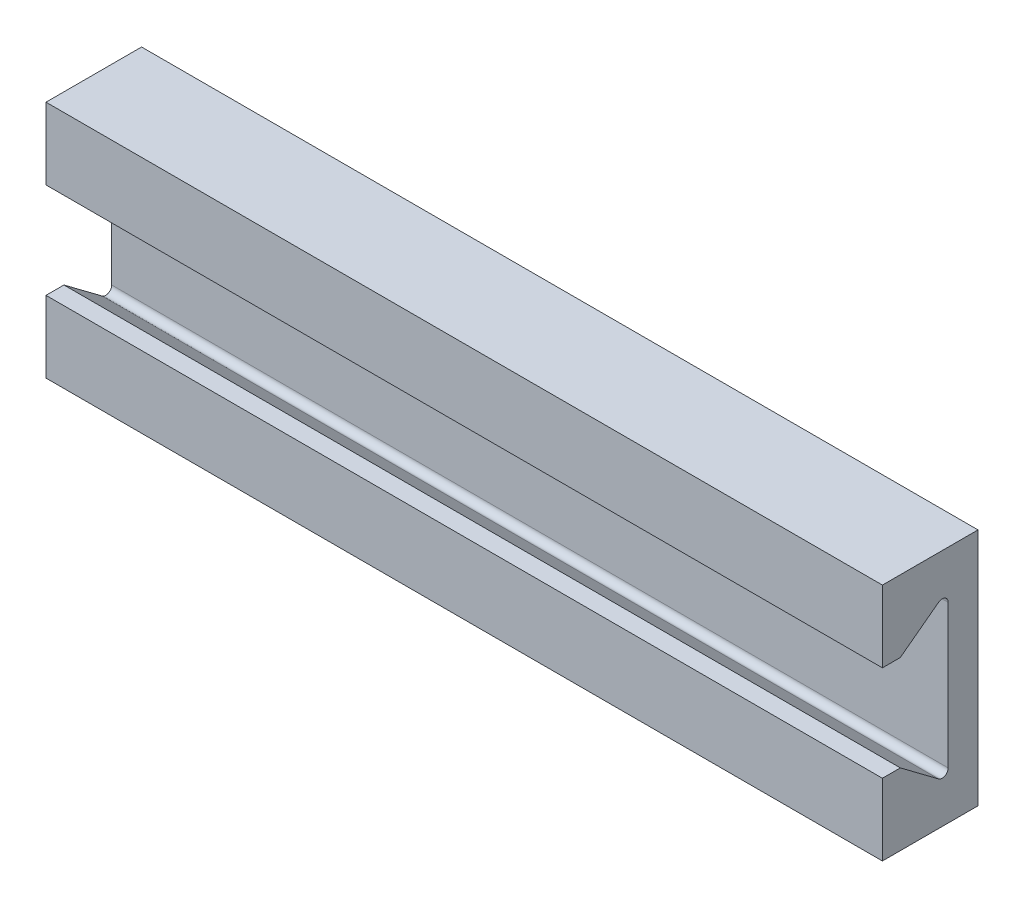
ISO-10303-21;
HEADER;
FILE_DESCRIPTION(('STEP AP214'),'2;1');
FILE_NAME('part.step','',(''),(''),'','','');
FILE_SCHEMA(('AUTOMOTIVE_DESIGN { 1 0 10303 214 1 1 1 1 }'));
ENDSEC;
DATA;
#1=APPLICATION_CONTEXT('core data for automotive mechanical design processes');
#2=APPLICATION_PROTOCOL_DEFINITION('international standard','automotive_design',2000,#1);
#3=PRODUCT_CONTEXT('',#1,'mechanical');
#4=PRODUCT('Part','Part','',(#3));
#5=PRODUCT_RELATED_PRODUCT_CATEGORY('part','',(#4));
#6=PRODUCT_DEFINITION_FORMATION('','',#4);
#7=PRODUCT_DEFINITION_CONTEXT('part definition',#1,'design');
#8=PRODUCT_DEFINITION('design','',#6,#7);
#9=PRODUCT_DEFINITION_SHAPE('','',#8);
#10=(LENGTH_UNIT() NAMED_UNIT(*) SI_UNIT(.MILLI.,.METRE.));
#11=(NAMED_UNIT(*) PLANE_ANGLE_UNIT() SI_UNIT($,.RADIAN.));
#12=(NAMED_UNIT(*) SI_UNIT($,.STERADIAN.) SOLID_ANGLE_UNIT());
#13=UNCERTAINTY_MEASURE_WITH_UNIT(LENGTH_MEASURE(1.E-05),#10,'distance_accuracy_value','');
#14=(GEOMETRIC_REPRESENTATION_CONTEXT(3) GLOBAL_UNCERTAINTY_ASSIGNED_CONTEXT((#13)) GLOBAL_UNIT_ASSIGNED_CONTEXT((#10,
#11,#12)) REPRESENTATION_CONTEXT('',''));
#15=CARTESIAN_POINT('',(0.,0.,0.));
#16=DIRECTION('',(0.,0.,1.));
#17=DIRECTION('',(1.,0.,0.));
#18=AXIS2_PLACEMENT_3D('',#15,#16,#17);
#19=CARTESIAN_POINT('',(0.,0.,8.));
#20=DIRECTION('',(0.,0.,-1.));
#21=DIRECTION('',(-1.,0.,0.));
#22=AXIS2_PLACEMENT_3D('',#19,#20,#21);
#23=PLANE('',#22);
#24=DIRECTION('',(0.,-1.,0.));
#25=VECTOR('',#24,1.);
#26=CARTESIAN_POINT('',(0.,0.,8.));
#27=LINE('',#26,#25);
#28=CARTESIAN_POINT('',(0.,20.,8.));
#29=VERTEX_POINT('',#28);
#30=CARTESIAN_POINT('',(0.,14.,8.));
#31=VERTEX_POINT('',#30);
#32=EDGE_CURVE('E172',#29,#31,#27,.T.);
#33=ORIENTED_EDGE('',*,*,#32,.T.);
#34=DIRECTION('',(1.,0.,0.));
#35=VECTOR('',#34,1.);
#36=CARTESIAN_POINT('',(0.,14.,8.));
#37=LINE('',#36,#35);
#38=CARTESIAN_POINT('',(70.,14.,8.));
#39=VERTEX_POINT('',#38);
#40=EDGE_CURVE('E165',#31,#39,#37,.T.);
#41=ORIENTED_EDGE('',*,*,#40,.T.);
#42=DIRECTION('',(0.,1.,0.));
#43=VECTOR('',#42,1.);
#44=CARTESIAN_POINT('',(70.,0.,8.));
#45=LINE('',#44,#43);
#46=CARTESIAN_POINT('',(70.,20.,8.));
#47=VERTEX_POINT('',#46);
#48=EDGE_CURVE('E177',#39,#47,#45,.T.);
#49=ORIENTED_EDGE('',*,*,#48,.T.);
#50=DIRECTION('',(-1.,0.,0.));
#51=VECTOR('',#50,1.);
#52=CARTESIAN_POINT('',(0.,20.,8.));
#53=LINE('',#52,#51);
#54=EDGE_CURVE('E181',#47,#29,#53,.T.);
#55=ORIENTED_EDGE('',*,*,#54,.T.);
#56=EDGE_LOOP('',(#33,#41,#49,#55));
#57=FACE_BOUND('',#56,.T.);
#58=ADVANCED_FACE('F33',(#57),#23,.F.);
#59=CARTESIAN_POINT('',(0.,0.,8.));
#60=DIRECTION('',(1.,0.,0.));
#61=DIRECTION('',(0.,0.,-1.));
#62=AXIS2_PLACEMENT_3D('',#59,#60,#61);
#63=PLANE('',#62);
#64=DIRECTION('',(0.,1.,0.));
#65=VECTOR('',#64,1.);
#66=CARTESIAN_POINT('',(0.,3.,2.5));
#67=LINE('',#66,#65);
#68=CARTESIAN_POINT('',(0.,4.,2.5));
#69=VERTEX_POINT('',#68);
#70=CARTESIAN_POINT('',(0.,16.,2.5));
#71=VERTEX_POINT('',#70);
#72=EDGE_CURVE('E142',#69,#71,#67,.T.);
#73=ORIENTED_EDGE('',*,*,#72,.T.);
#74=CARTESIAN_POINT('',(0.,16.,3.));
#75=DIRECTION('',(1.,0.,0.));
#76=DIRECTION('',(0.,0.,-1.));
#77=AXIS2_PLACEMENT_3D('',#74,#75,#76);
#78=CIRCLE('',#77,0.5);
#79=CARTESIAN_POINT('',(0.,16.4,3.3));
#80=VERTEX_POINT('',#79);
#81=EDGE_CURVE('E11',#71,#80,#78,.T.);
#82=ORIENTED_EDGE('',*,*,#81,.T.);
#83=DIRECTION('',(0.,-0.6,0.8));
#84=VECTOR('',#83,1.);
#85=CARTESIAN_POINT('',(0.,14.,6.5));
#86=LINE('',#85,#84);
#87=CARTESIAN_POINT('',(0.,14.,6.5));
#88=VERTEX_POINT('',#87);
#89=EDGE_CURVE('E154',#80,#88,#86,.T.);
#90=ORIENTED_EDGE('',*,*,#89,.T.);
#91=DIRECTION('',(0.,0.,1.));
#92=VECTOR('',#91,1.);
#93=CARTESIAN_POINT('',(0.,14.,6.5));
#94=LINE('',#93,#92);
#95=EDGE_CURVE('E156',#88,#31,#94,.T.);
#96=ORIENTED_EDGE('',*,*,#95,.T.);
#97=ORIENTED_EDGE('',*,*,#32,.F.);
#98=DIRECTION('',(0.,0.,-1.));
#99=VECTOR('',#98,1.);
#100=CARTESIAN_POINT('',(0.,20.,8.));
#101=LINE('',#100,#99);
#102=CARTESIAN_POINT('',(0.,20.,0.));
#103=VERTEX_POINT('',#102);
#104=EDGE_CURVE('E183',#29,#103,#101,.T.);
#105=ORIENTED_EDGE('',*,*,#104,.T.);
#106=DIRECTION('',(0.,-1.,0.));
#107=VECTOR('',#106,1.);
#108=CARTESIAN_POINT('',(0.,0.,0.));
#109=LINE('',#108,#107);
#110=CARTESIAN_POINT('',(0.,0.,0.));
#111=VERTEX_POINT('',#110);
#112=EDGE_CURVE('E168',#103,#111,#109,.T.);
#113=ORIENTED_EDGE('',*,*,#112,.T.);
#114=DIRECTION('',(0.,0.,-1.));
#115=VECTOR('',#114,1.);
#116=CARTESIAN_POINT('',(0.,0.,8.));
#117=LINE('',#116,#115);
#118=CARTESIAN_POINT('',(0.,0.,8.));
#119=VERTEX_POINT('',#118);
#120=EDGE_CURVE('E200',#119,#111,#117,.T.);
#121=ORIENTED_EDGE('',*,*,#120,.F.);
#122=CARTESIAN_POINT('',(0.,6.,8.));
#123=VERTEX_POINT('',#122);
#124=EDGE_CURVE('E147',#123,#119,#27,.T.);
#125=ORIENTED_EDGE('',*,*,#124,.F.);
#126=DIRECTION('',(0.,0.,-1.));
#127=VECTOR('',#126,1.);
#128=CARTESIAN_POINT('',(0.,6.,8.));
#129=LINE('',#128,#127);
#130=CARTESIAN_POINT('',(0.,6.,6.5));
#131=VERTEX_POINT('',#130);
#132=EDGE_CURVE('E125',#123,#131,#129,.T.);
#133=ORIENTED_EDGE('',*,*,#132,.T.);
#134=DIRECTION('',(0.,-0.6,-0.8));
#135=VECTOR('',#134,1.);
#136=CARTESIAN_POINT('',(0.,3.,2.5));
#137=LINE('',#136,#135);
#138=CARTESIAN_POINT('',(0.,3.6,3.3));
#139=VERTEX_POINT('',#138);
#140=EDGE_CURVE('E136',#131,#139,#137,.T.);
#141=ORIENTED_EDGE('',*,*,#140,.T.);
#142=CARTESIAN_POINT('',(0.,4.,3.));
#143=DIRECTION('',(1.,0.,0.));
#144=DIRECTION('',(0.,0.,-1.));
#145=AXIS2_PLACEMENT_3D('',#142,#143,#144);
#146=CIRCLE('',#145,0.5);
#147=EDGE_CURVE('E209',#139,#69,#146,.T.);
#148=ORIENTED_EDGE('',*,*,#147,.T.);
#149=EDGE_LOOP('',(#73,#82,#90,#96,#97,#105,#113,#121,#125,#133,#141,#148));
#150=FACE_BOUND('',#149,.T.);
#151=ADVANCED_FACE('F145',(#150),#63,.F.);
#152=CARTESIAN_POINT('',(0.,0.,8.));
#153=DIRECTION('',(0.,1.,0.));
#154=DIRECTION('',(0.,0.,1.));
#155=AXIS2_PLACEMENT_3D('',#152,#153,#154);
#156=PLANE('',#155);
#157=DIRECTION('',(1.,0.,0.));
#158=VECTOR('',#157,1.);
#159=CARTESIAN_POINT('',(0.,0.,0.));
#160=LINE('',#159,#158);
#161=CARTESIAN_POINT('',(70.,0.,0.));
#162=VERTEX_POINT('',#161);
#163=EDGE_CURVE('E186',#111,#162,#160,.T.);
#164=ORIENTED_EDGE('',*,*,#163,.T.);
#165=DIRECTION('',(0.,0.,-1.));
#166=VECTOR('',#165,1.);
#167=CARTESIAN_POINT('',(70.,0.,8.));
#168=LINE('',#167,#166);
#169=CARTESIAN_POINT('',(70.,0.,8.));
#170=VERTEX_POINT('',#169);
#171=EDGE_CURVE('E197',#170,#162,#168,.T.);
#172=ORIENTED_EDGE('',*,*,#171,.F.);
#173=DIRECTION('',(1.,0.,0.));
#174=VECTOR('',#173,1.);
#175=CARTESIAN_POINT('',(0.,0.,8.));
#176=LINE('',#175,#174);
#177=EDGE_CURVE('E175',#119,#170,#176,.T.);
#178=ORIENTED_EDGE('',*,*,#177,.F.);
#179=ORIENTED_EDGE('',*,*,#120,.T.);
#180=EDGE_LOOP('',(#164,#172,#178,#179));
#181=FACE_BOUND('',#180,.T.);
#182=ADVANCED_FACE('F245',(#181),#156,.F.);
#183=CARTESIAN_POINT('',(70.,0.,8.));
#184=DIRECTION('',(-1.,0.,0.));
#185=DIRECTION('',(0.,0.,1.));
#186=AXIS2_PLACEMENT_3D('',#183,#184,#185);
#187=PLANE('',#186);
#188=ORIENTED_EDGE('',*,*,#48,.F.);
#189=DIRECTION('',(0.,0.,1.));
#190=VECTOR('',#189,1.);
#191=CARTESIAN_POINT('',(70.,14.,6.5));
#192=LINE('',#191,#190);
#193=CARTESIAN_POINT('',(70.,14.,6.5));
#194=VERTEX_POINT('',#193);
#195=EDGE_CURVE('E148',#194,#39,#192,.T.);
#196=ORIENTED_EDGE('',*,*,#195,.F.);
#197=DIRECTION('',(0.,-0.6,0.8));
#198=VECTOR('',#197,1.);
#199=CARTESIAN_POINT('',(70.,14.,6.5));
#200=LINE('',#199,#198);
#201=CARTESIAN_POINT('',(70.,16.4,3.3));
#202=VERTEX_POINT('',#201);
#203=EDGE_CURVE('E150',#202,#194,#200,.T.);
#204=ORIENTED_EDGE('',*,*,#203,.F.);
#205=CARTESIAN_POINT('',(70.,16.,3.));
#206=DIRECTION('',(-1.,0.,0.));
#207=DIRECTION('',(0.,0.,1.));
#208=AXIS2_PLACEMENT_3D('',#205,#206,#207);
#209=CIRCLE('',#208,0.5);
#210=CARTESIAN_POINT('',(70.,16.,2.5));
#211=VERTEX_POINT('',#210);
#212=EDGE_CURVE('E41',#202,#211,#209,.T.);
#213=ORIENTED_EDGE('',*,*,#212,.T.);
#214=DIRECTION('',(0.,1.,0.));
#215=VECTOR('',#214,1.);
#216=CARTESIAN_POINT('',(70.,3.,2.5));
#217=LINE('',#216,#215);
#218=CARTESIAN_POINT('',(70.,4.,2.5));
#219=VERTEX_POINT('',#218);
#220=EDGE_CURVE('E162',#219,#211,#217,.T.);
#221=ORIENTED_EDGE('',*,*,#220,.F.);
#222=CARTESIAN_POINT('',(70.,4.,3.));
#223=DIRECTION('',(-1.,0.,0.));
#224=DIRECTION('',(0.,0.,1.));
#225=AXIS2_PLACEMENT_3D('',#222,#223,#224);
#226=CIRCLE('',#225,0.5);
#227=CARTESIAN_POINT('',(70.,3.6,3.3));
#228=VERTEX_POINT('',#227);
#229=EDGE_CURVE('E207',#219,#228,#226,.T.);
#230=ORIENTED_EDGE('',*,*,#229,.T.);
#231=DIRECTION('',(0.,-0.6,-0.8));
#232=VECTOR('',#231,1.);
#233=CARTESIAN_POINT('',(70.,3.,2.5));
#234=LINE('',#233,#232);
#235=CARTESIAN_POINT('',(70.,6.,6.5));
#236=VERTEX_POINT('',#235);
#237=EDGE_CURVE('E160',#236,#228,#234,.T.);
#238=ORIENTED_EDGE('',*,*,#237,.F.);
#239=DIRECTION('',(0.,0.,-1.));
#240=VECTOR('',#239,1.);
#241=CARTESIAN_POINT('',(70.,6.,8.));
#242=LINE('',#241,#240);
#243=CARTESIAN_POINT('',(70.,6.,8.));
#244=VERTEX_POINT('',#243);
#245=EDGE_CURVE('E128',#244,#236,#242,.T.);
#246=ORIENTED_EDGE('',*,*,#245,.F.);
#247=EDGE_CURVE('E178',#170,#244,#45,.T.);
#248=ORIENTED_EDGE('',*,*,#247,.F.);
#249=ORIENTED_EDGE('',*,*,#171,.T.);
#250=DIRECTION('',(0.,1.,0.));
#251=VECTOR('',#250,1.);
#252=CARTESIAN_POINT('',(70.,0.,0.));
#253=LINE('',#252,#251);
#254=CARTESIAN_POINT('',(70.,20.,0.));
#255=VERTEX_POINT('',#254);
#256=EDGE_CURVE('E188',#162,#255,#253,.T.);
#257=ORIENTED_EDGE('',*,*,#256,.T.);
#258=DIRECTION('',(0.,0.,-1.));
#259=VECTOR('',#258,1.);
#260=CARTESIAN_POINT('',(70.,20.,8.));
#261=LINE('',#260,#259);
#262=EDGE_CURVE('E194',#47,#255,#261,.T.);
#263=ORIENTED_EDGE('',*,*,#262,.F.);
#264=EDGE_LOOP('',(#188,#196,#204,#213,#221,#230,#238,#246,#248,#249,#257,#263));
#265=FACE_BOUND('',#264,.T.);
#266=ADVANCED_FACE('F223',(#265),#187,.F.);
#267=CARTESIAN_POINT('',(0.,20.,8.));
#268=DIRECTION('',(0.,-1.,0.));
#269=DIRECTION('',(0.,0.,-1.));
#270=AXIS2_PLACEMENT_3D('',#267,#268,#269);
#271=PLANE('',#270);
#272=DIRECTION('',(-1.,0.,0.));
#273=VECTOR('',#272,1.);
#274=CARTESIAN_POINT('',(0.,20.,0.));
#275=LINE('',#274,#273);
#276=EDGE_CURVE('E190',#255,#103,#275,.T.);
#277=ORIENTED_EDGE('',*,*,#276,.T.);
#278=ORIENTED_EDGE('',*,*,#104,.F.);
#279=ORIENTED_EDGE('',*,*,#54,.F.);
#280=ORIENTED_EDGE('',*,*,#262,.T.);
#281=EDGE_LOOP('',(#277,#278,#279,#280));
#282=FACE_BOUND('',#281,.T.);
#283=ADVANCED_FACE('F251',(#282),#271,.F.);
#284=ORIENTED_EDGE('',*,*,#247,.T.);
#285=DIRECTION('',(1.,0.,0.));
#286=VECTOR('',#285,1.);
#287=CARTESIAN_POINT('',(0.,6.,8.));
#288=LINE('',#287,#286);
#289=EDGE_CURVE('E133',#123,#244,#288,.T.);
#290=ORIENTED_EDGE('',*,*,#289,.F.);
#291=ORIENTED_EDGE('',*,*,#124,.T.);
#292=ORIENTED_EDGE('',*,*,#177,.T.);
#293=EDGE_LOOP('',(#284,#290,#291,#292));
#294=FACE_BOUND('',#293,.T.);
#295=ADVANCED_FACE('F241',(#294),#23,.F.);
#296=CARTESIAN_POINT('',(0.,0.,0.));
#297=DIRECTION('',(0.,0.,-1.));
#298=DIRECTION('',(-1.,0.,0.));
#299=AXIS2_PLACEMENT_3D('',#296,#297,#298);
#300=PLANE('',#299);
#301=ORIENTED_EDGE('',*,*,#112,.F.);
#302=ORIENTED_EDGE('',*,*,#276,.F.);
#303=ORIENTED_EDGE('',*,*,#256,.F.);
#304=ORIENTED_EDGE('',*,*,#163,.F.);
#305=EDGE_LOOP('',(#301,#302,#303,#304));
#306=FACE_BOUND('',#305,.T.);
#307=ADVANCED_FACE('F250',(#306),#300,.T.);
#308=CARTESIAN_POINT('',(0.,14.,6.5));
#309=DIRECTION('',(0.,1.,0.));
#310=DIRECTION('',(0.,0.,1.));
#311=AXIS2_PLACEMENT_3D('',#308,#309,#310);
#312=PLANE('',#311);
#313=ORIENTED_EDGE('',*,*,#195,.T.);
#314=ORIENTED_EDGE('',*,*,#40,.F.);
#315=ORIENTED_EDGE('',*,*,#95,.F.);
#316=DIRECTION('',(1.,0.,0.));
#317=VECTOR('',#316,1.);
#318=CARTESIAN_POINT('',(0.,14.,6.5));
#319=LINE('',#318,#317);
#320=EDGE_CURVE('E132',#88,#194,#319,.T.);
#321=ORIENTED_EDGE('',*,*,#320,.T.);
#322=EDGE_LOOP('',(#313,#314,#315,#321));
#323=FACE_BOUND('',#322,.T.);
#324=ADVANCED_FACE('F226',(#323),#312,.F.);
#325=CARTESIAN_POINT('',(0.,14.,6.5));
#326=DIRECTION('',(0.,0.8,0.6));
#327=DIRECTION('',(0.,-0.6,0.8));
#328=AXIS2_PLACEMENT_3D('',#325,#326,#327);
#329=PLANE('',#328);
#330=ORIENTED_EDGE('',*,*,#89,.F.);
#331=DIRECTION('',(1.,0.,0.));
#332=VECTOR('',#331,1.);
#333=CARTESIAN_POINT('',(70.,16.4,3.3));
#334=LINE('',#333,#332);
#335=EDGE_CURVE('E211',#80,#202,#334,.T.);
#336=ORIENTED_EDGE('',*,*,#335,.T.);
#337=ORIENTED_EDGE('',*,*,#203,.T.);
#338=ORIENTED_EDGE('',*,*,#320,.F.);
#339=EDGE_LOOP('',(#330,#336,#337,#338));
#340=FACE_BOUND('',#339,.T.);
#341=ADVANCED_FACE('F217',(#340),#329,.F.);
#342=CARTESIAN_POINT('',(0.,3.,2.5));
#343=DIRECTION('',(0.,0.,-1.));
#344=DIRECTION('',(-1.,0.,0.));
#345=AXIS2_PLACEMENT_3D('',#342,#343,#344);
#346=PLANE('',#345);
#347=ORIENTED_EDGE('',*,*,#220,.T.);
#348=DIRECTION('',(1.,0.,0.));
#349=VECTOR('',#348,1.);
#350=CARTESIAN_POINT('',(0.,16.,2.5));
#351=LINE('',#350,#349);
#352=EDGE_CURVE('E54',#211,#71,#351,.F.);
#353=ORIENTED_EDGE('',*,*,#352,.T.);
#354=ORIENTED_EDGE('',*,*,#72,.F.);
#355=DIRECTION('',(1.,0.,0.));
#356=VECTOR('',#355,1.);
#357=CARTESIAN_POINT('',(70.,4.,2.5));
#358=LINE('',#357,#356);
#359=EDGE_CURVE('E203',#69,#219,#358,.T.);
#360=ORIENTED_EDGE('',*,*,#359,.T.);
#361=EDGE_LOOP('',(#347,#353,#354,#360));
#362=FACE_BOUND('',#361,.T.);
#363=ADVANCED_FACE('F265',(#362),#346,.F.);
#364=CARTESIAN_POINT('',(0.,3.,2.5));
#365=DIRECTION('',(0.,-0.8,0.6));
#366=DIRECTION('',(0.,-0.6,-0.8));
#367=AXIS2_PLACEMENT_3D('',#364,#365,#366);
#368=PLANE('',#367);
#369=ORIENTED_EDGE('',*,*,#237,.T.);
#370=DIRECTION('',(1.,0.,0.));
#371=VECTOR('',#370,1.);
#372=CARTESIAN_POINT('',(0.,3.6,3.3));
#373=LINE('',#372,#371);
#374=EDGE_CURVE('E139',#228,#139,#373,.F.);
#375=ORIENTED_EDGE('',*,*,#374,.T.);
#376=ORIENTED_EDGE('',*,*,#140,.F.);
#377=DIRECTION('',(1.,0.,0.));
#378=VECTOR('',#377,1.);
#379=CARTESIAN_POINT('',(0.,6.,6.5));
#380=LINE('',#379,#378);
#381=EDGE_CURVE('E121',#131,#236,#380,.T.);
#382=ORIENTED_EDGE('',*,*,#381,.T.);
#383=EDGE_LOOP('',(#369,#375,#376,#382));
#384=FACE_BOUND('',#383,.T.);
#385=ADVANCED_FACE('F137',(#384),#368,.F.);
#386=CARTESIAN_POINT('',(0.,6.,8.));
#387=DIRECTION('',(0.,-1.,0.));
#388=DIRECTION('',(0.,0.,-1.));
#389=AXIS2_PLACEMENT_3D('',#386,#387,#388);
#390=PLANE('',#389);
#391=ORIENTED_EDGE('',*,*,#245,.T.);
#392=ORIENTED_EDGE('',*,*,#381,.F.);
#393=ORIENTED_EDGE('',*,*,#132,.F.);
#394=ORIENTED_EDGE('',*,*,#289,.T.);
#395=EDGE_LOOP('',(#391,#392,#393,#394));
#396=FACE_BOUND('',#395,.T.);
#397=ADVANCED_FACE('F123',(#396),#390,.F.);
#398=CARTESIAN_POINT('',(0.,4.,3.));
#399=DIRECTION('',(-1.,0.,0.));
#400=DIRECTION('',(0.,0.,1.));
#401=AXIS2_PLACEMENT_3D('',#398,#399,#400);
#402=CYLINDRICAL_SURFACE('',#401,0.5);
#403=ORIENTED_EDGE('',*,*,#147,.F.);
#404=ORIENTED_EDGE('',*,*,#374,.F.);
#405=ORIENTED_EDGE('',*,*,#229,.F.);
#406=ORIENTED_EDGE('',*,*,#359,.F.);
#407=EDGE_LOOP('',(#403,#404,#405,#406));
#408=FACE_BOUND('',#407,.T.);
#409=ADVANCED_FACE('F234',(#408),#402,.F.);
#410=CARTESIAN_POINT('',(0.,16.,3.));
#411=DIRECTION('',(-1.,0.,0.));
#412=DIRECTION('',(0.,0.,1.));
#413=AXIS2_PLACEMENT_3D('',#410,#411,#412);
#414=CYLINDRICAL_SURFACE('',#413,0.5);
#415=ORIENTED_EDGE('',*,*,#81,.F.);
#416=ORIENTED_EDGE('',*,*,#352,.F.);
#417=ORIENTED_EDGE('',*,*,#212,.F.);
#418=ORIENTED_EDGE('',*,*,#335,.F.);
#419=EDGE_LOOP('',(#415,#416,#417,#418));
#420=FACE_BOUND('',#419,.T.);
#421=ADVANCED_FACE('F35',(#420),#414,.F.);
#422=CLOSED_SHELL('',(#58,#151,#182,#266,#283,#295,#307,#324,#341,#363,#385,#397,#409,#421));
#423=MANIFOLD_SOLID_BREP('B2',#422);
#424=ADVANCED_BREP_SHAPE_REPRESENTATION('',(#18,#423),#14);
#425=SHAPE_DEFINITION_REPRESENTATION(#9,#424);
ENDSEC;
END-ISO-10303-21;
